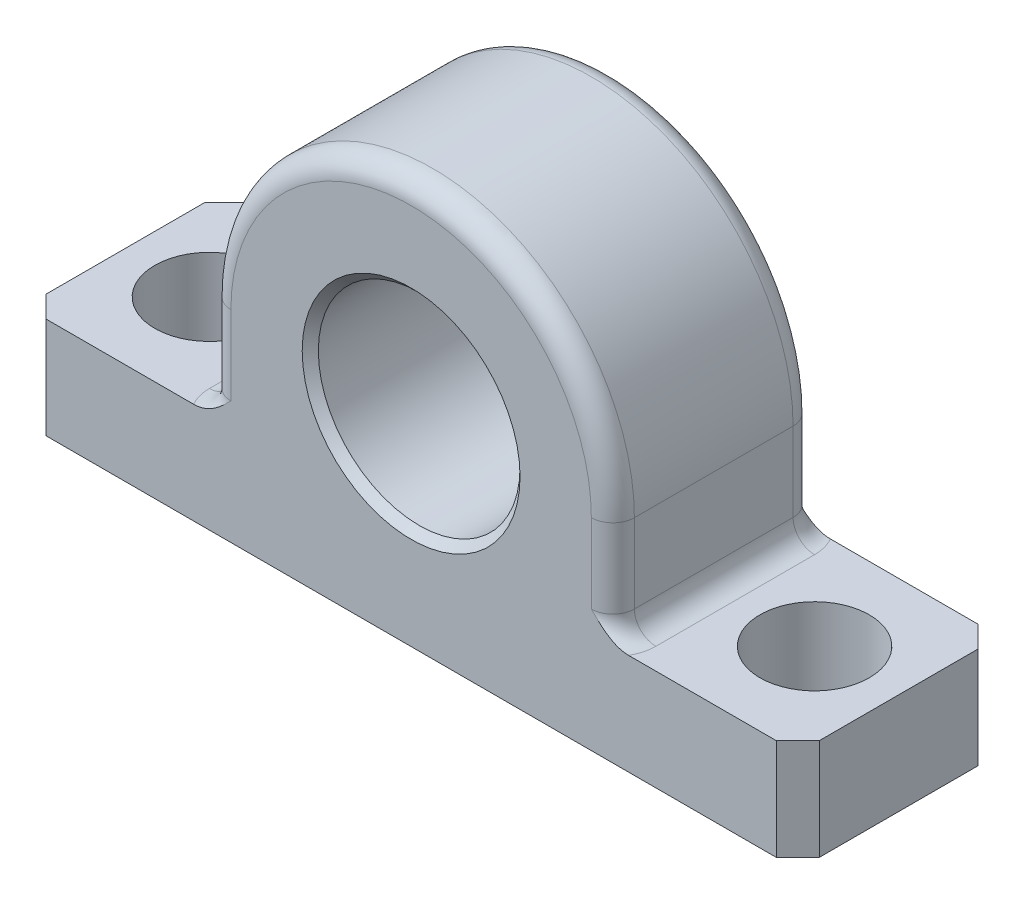
ISO-10303-21;
HEADER;
FILE_DESCRIPTION(('STEP AP214'),'2;1');
FILE_NAME('part.step','',(''),(''),'','','');
FILE_SCHEMA(('AUTOMOTIVE_DESIGN { 1 0 10303 214 1 1 1 1 }'));
ENDSEC;
DATA;
#1=APPLICATION_CONTEXT('core data for automotive mechanical design processes');
#2=APPLICATION_PROTOCOL_DEFINITION('international standard','automotive_design',2000,#1);
#3=PRODUCT_CONTEXT('',#1,'mechanical');
#4=PRODUCT('Part','Part','',(#3));
#5=PRODUCT_RELATED_PRODUCT_CATEGORY('part','',(#4));
#6=PRODUCT_DEFINITION_FORMATION('','',#4);
#7=PRODUCT_DEFINITION_CONTEXT('part definition',#1,'design');
#8=PRODUCT_DEFINITION('design','',#6,#7);
#9=PRODUCT_DEFINITION_SHAPE('','',#8);
#10=(LENGTH_UNIT() NAMED_UNIT(*) SI_UNIT(.MILLI.,.METRE.));
#11=(NAMED_UNIT(*) PLANE_ANGLE_UNIT() SI_UNIT($,.RADIAN.));
#12=(NAMED_UNIT(*) SI_UNIT($,.STERADIAN.) SOLID_ANGLE_UNIT());
#13=UNCERTAINTY_MEASURE_WITH_UNIT(LENGTH_MEASURE(1.E-05),#10,'distance_accuracy_value','');
#14=(GEOMETRIC_REPRESENTATION_CONTEXT(3) GLOBAL_UNCERTAINTY_ASSIGNED_CONTEXT((#13)) GLOBAL_UNIT_ASSIGNED_CONTEXT((#10,
#11,#12)) REPRESENTATION_CONTEXT('',''));
#15=CARTESIAN_POINT('',(0.,0.,0.));
#16=DIRECTION('',(0.,0.,1.));
#17=DIRECTION('',(1.,0.,0.));
#18=AXIS2_PLACEMENT_3D('',#15,#16,#17);
#19=CARTESIAN_POINT('',(0.,9.525,4.7625));
#20=DIRECTION('',(0.,0.,1.));
#21=DIRECTION('',(1.,0.,0.));
#22=AXIS2_PLACEMENT_3D('',#19,#20,#21);
#23=PLANE('',#22);
#24=CARTESIAN_POINT('',(0.,9.525,4.7625));
#25=DIRECTION('',(0.,0.,1.));
#26=DIRECTION('',(1.,0.,0.));
#27=AXIS2_PLACEMENT_3D('',#24,#25,#26);
#28=CIRCLE('',#27,5.14350000000001);
#29=CARTESIAN_POINT('',(5.14350000000001,9.525,4.7625));
#30=VERTEX_POINT('',#29);
#31=EDGE_CURVE('E12',#30,#30,#28,.F.);
#32=ORIENTED_EDGE('',*,*,#31,.T.);
#33=EDGE_LOOP('',(#32));
#34=FACE_BOUND('',#33,.T.);
#35=DIRECTION('',(1.,0.,0.));
#36=VECTOR('',#35,1.);
#37=CARTESIAN_POINT('',(-18.25625,0.,4.7625));
#38=LINE('',#37,#36);
#39=CARTESIAN_POINT('',(-17.24025,0.,4.7625));
#40=VERTEX_POINT('',#39);
#41=CARTESIAN_POINT('',(17.24025,0.,4.7625));
#42=VERTEX_POINT('',#41);
#43=EDGE_CURVE('E560',#40,#42,#38,.T.);
#44=ORIENTED_EDGE('',*,*,#43,.T.);
#45=DIRECTION('',(0.,1.,0.));
#46=VECTOR('',#45,1.);
#47=CARTESIAN_POINT('',(17.24025,4.7752,4.7625));
#48=LINE('',#47,#46);
#49=CARTESIAN_POINT('',(17.24025,4.7752,4.7625));
#50=VERTEX_POINT('',#49);
#51=EDGE_CURVE('E640',#42,#50,#48,.T.);
#52=ORIENTED_EDGE('',*,*,#51,.T.);
#53=DIRECTION('',(-1.,0.,0.));
#54=VECTOR('',#53,1.);
#55=CARTESIAN_POINT('',(18.25625,4.7752,4.7625));
#56=LINE('',#55,#54);
#57=CARTESIAN_POINT('',(10.26876362049,4.7752,4.7625));
#58=VERTEX_POINT('',#57);
#59=EDGE_CURVE('E563',#50,#58,#56,.T.);
#60=ORIENTED_EDGE('',*,*,#59,.T.);
#61=CARTESIAN_POINT('',(10.26876362049,4.7752,4.7625));
#62=CARTESIAN_POINT('',(10.2252224027002,4.77519715153089,4.7625));
#63=CARTESIAN_POINT('',(10.1817186469744,4.77729908415182,4.7625));
#64=CARTESIAN_POINT('',(10.0951431421564,4.78543311730859,4.7625));
#65=CARTESIAN_POINT('',(10.0520708367528,4.79145923686937,4.7625));
#66=CARTESIAN_POINT('',(9.92491100410121,4.8148188166604,4.7625));
#67=CARTESIAN_POINT('',(9.8417731096432,4.83744841735983,4.7625));
#68=CARTESIAN_POINT('',(9.64960395528768,4.90514776145384,4.7625));
#69=CARTESIAN_POINT('',(9.54245182214935,4.9554346756508,4.7625));
#70=CARTESIAN_POINT('',(9.3369479729002,5.0721817196215,4.7625));
#71=CARTESIAN_POINT('',(9.23864879178819,5.13873067438191,4.7625));
#72=CARTESIAN_POINT('',(9.03093152267288,5.29684050941528,4.7625));
#73=CARTESIAN_POINT('',(8.92334332463209,5.39073377638267,4.7625));
#74=CARTESIAN_POINT('',(8.71499236059108,5.585304752486,4.7625));
#75=CARTESIAN_POINT('',(8.61422432576015,5.68597710175247,4.7625));
#76=CARTESIAN_POINT('',(8.51200518031524,5.78819482090242,4.7625));
#77=CARTESIAN_POINT('',(8.5105025899316,5.78969741130469,4.7625));
#78=CARTESIAN_POINT('',(8.509,5.7912,4.7625));
#79=B_SPLINE_CURVE_WITH_KNOTS('',3,(#61,#62,#63,#64,#65,#66,#67,#68,#69,#70,#71,#72,#73,#74,#75,
#76,#77,#78),.UNSPECIFIED.,.F.,.F.,(4,2,2,2,2,2,2,2,4),(0.,0.130511550541221,0.260824648481426,
0.518174407674975,0.871304804754064,1.22640893116385,1.65404399644587,2.08134483510441,
2.08771978608463),.UNSPECIFIED.);
#80=CARTESIAN_POINT('',(8.509,5.7912,4.7625));
#81=VERTEX_POINT('',#80);
#82=EDGE_CURVE('E264',#58,#81,#79,.T.);
#83=ORIENTED_EDGE('',*,*,#82,.T.);
#84=DIRECTION('',(0.,1.,0.));
#85=VECTOR('',#84,1.);
#86=CARTESIAN_POINT('',(8.509,9.525,4.7625));
#87=LINE('',#86,#85);
#88=CARTESIAN_POINT('',(8.509,9.525,4.7625));
#89=VERTEX_POINT('',#88);
#90=EDGE_CURVE('E224',#81,#89,#87,.T.);
#91=ORIENTED_EDGE('',*,*,#90,.T.);
#92=CARTESIAN_POINT('',(0.,9.525,4.7625));
#93=DIRECTION('',(0.,0.,1.));
#94=DIRECTION('',(1.,0.,0.));
#95=AXIS2_PLACEMENT_3D('',#92,#93,#94);
#96=CIRCLE('',#95,8.509);
#97=CARTESIAN_POINT('',(-8.509,9.525,4.7625));
#98=VERTEX_POINT('',#97);
#99=EDGE_CURVE('E222',#89,#98,#96,.T.);
#100=ORIENTED_EDGE('',*,*,#99,.T.);
#101=DIRECTION('',(0.,-1.,0.));
#102=VECTOR('',#101,1.);
#103=CARTESIAN_POINT('',(-8.509,4.7752,4.7625));
#104=LINE('',#103,#102);
#105=CARTESIAN_POINT('',(-8.509,5.7912,4.7625));
#106=VERTEX_POINT('',#105);
#107=EDGE_CURVE('E205',#98,#106,#104,.T.);
#108=ORIENTED_EDGE('',*,*,#107,.T.);
#109=CARTESIAN_POINT('',(-10.26876362049,4.7752,4.7625));
#110=CARTESIAN_POINT('',(-10.2252224027002,4.77519715153089,4.7625));
#111=CARTESIAN_POINT('',(-10.1817186469745,4.77729908415181,4.7625));
#112=CARTESIAN_POINT('',(-10.0951431421564,4.78543311730858,4.7625));
#113=CARTESIAN_POINT('',(-10.0520708367528,4.79145923686936,4.7625));
#114=CARTESIAN_POINT('',(-9.92491100410126,4.81481881666039,4.7625));
#115=CARTESIAN_POINT('',(-9.84177310964322,4.83744841735983,4.7625));
#116=CARTESIAN_POINT('',(-9.64960395528766,4.90514776145384,4.7625));
#117=CARTESIAN_POINT('',(-9.5424518221493,4.9554346756508,4.7625));
#118=CARTESIAN_POINT('',(-9.33694797290018,5.07218171962153,4.7625));
#119=CARTESIAN_POINT('',(-9.23864879178821,5.13873067438196,4.7625));
#120=CARTESIAN_POINT('',(-9.03093152267284,5.29684050941523,4.7625));
#121=CARTESIAN_POINT('',(-8.92334332463192,5.39073377638248,4.7625));
#122=CARTESIAN_POINT('',(-8.71499236059126,5.58530475248616,4.7625));
#123=CARTESIAN_POINT('',(-8.61422432576081,5.68597710175313,4.7625));
#124=CARTESIAN_POINT('',(-8.51200518031525,5.78819482090244,4.7625));
#125=CARTESIAN_POINT('',(-8.5105025899316,5.7896974113047,4.7625));
#126=CARTESIAN_POINT('',(-8.509,5.7912,4.7625));
#127=B_SPLINE_CURVE_WITH_KNOTS('',3,(#109,#110,#111,#112,#113,#114,#115,#116,#117,#118,#119,
#120,#121,#122,#123,#124,#125,#126),.UNSPECIFIED.,.F.,.F.,(4,2,2,2,2,2,2,2,4),(0.,
0.130511550541186,0.260824648481355,0.518174407674975,0.87130480475412,1.22640893116385,
1.65404399644585,2.08134483510441,2.08771978608463),.UNSPECIFIED.);
#128=CARTESIAN_POINT('',(-10.26876362049,4.7752,4.7625));
#129=VERTEX_POINT('',#128);
#130=EDGE_CURVE('E294',#106,#129,#127,.F.);
#131=ORIENTED_EDGE('',*,*,#130,.T.);
#132=DIRECTION('',(-1.,0.,0.));
#133=VECTOR('',#132,1.);
#134=CARTESIAN_POINT('',(-18.25625,4.7752,4.7625));
#135=LINE('',#134,#133);
#136=CARTESIAN_POINT('',(-17.24025,4.7752,4.7625));
#137=VERTEX_POINT('',#136);
#138=EDGE_CURVE('E566',#129,#137,#135,.T.);
#139=ORIENTED_EDGE('',*,*,#138,.T.);
#140=DIRECTION('',(0.,-1.,0.));
#141=VECTOR('',#140,1.);
#142=CARTESIAN_POINT('',(-17.24025,0.,4.7625));
#143=LINE('',#142,#141);
#144=EDGE_CURVE('E637',#137,#40,#143,.T.);
#145=ORIENTED_EDGE('',*,*,#144,.T.);
#146=EDGE_LOOP('',(#44,#52,#60,#83,#91,#100,#108,#131,#139,#145));
#147=FACE_BOUND('',#146,.T.);
#148=ADVANCED_FACE('F36',(#34,#147),#23,.T.);
#149=CARTESIAN_POINT('',(0.,9.525,-4.7625));
#150=DIRECTION('',(0.,0.,1.));
#151=DIRECTION('',(1.,0.,0.));
#152=AXIS2_PLACEMENT_3D('',#149,#150,#151);
#153=PLANE('',#152);
#154=CARTESIAN_POINT('',(0.,9.525,-4.7625));
#155=DIRECTION('',(0.,0.,1.));
#156=DIRECTION('',(1.,0.,0.));
#157=AXIS2_PLACEMENT_3D('',#154,#155,#156);
#158=CIRCLE('',#157,5.14349999999998);
#159=CARTESIAN_POINT('',(5.14349999999999,9.525,-4.7625));
#160=VERTEX_POINT('',#159);
#161=EDGE_CURVE('E351',#160,#160,#158,.T.);
#162=ORIENTED_EDGE('',*,*,#161,.T.);
#163=EDGE_LOOP('',(#162));
#164=FACE_BOUND('',#163,.T.);
#165=DIRECTION('',(-1.,0.,0.));
#166=VECTOR('',#165,1.);
#167=CARTESIAN_POINT('',(18.25625,4.7752,-4.7625));
#168=LINE('',#167,#166);
#169=CARTESIAN_POINT('',(17.24025,4.7752,-4.7625));
#170=VERTEX_POINT('',#169);
#171=CARTESIAN_POINT('',(10.26876362049,4.7752,-4.7625));
#172=VERTEX_POINT('',#171);
#173=EDGE_CURVE('E572',#170,#172,#168,.T.);
#174=ORIENTED_EDGE('',*,*,#173,.F.);
#175=DIRECTION('',(0.,-1.,0.));
#176=VECTOR('',#175,1.);
#177=CARTESIAN_POINT('',(17.24025,9.52500000000002,-4.7625));
#178=LINE('',#177,#176);
#179=CARTESIAN_POINT('',(17.24025,0.,-4.7625));
#180=VERTEX_POINT('',#179);
#181=EDGE_CURVE('E627',#170,#180,#178,.T.);
#182=ORIENTED_EDGE('',*,*,#181,.T.);
#183=DIRECTION('',(1.,0.,0.));
#184=VECTOR('',#183,1.);
#185=CARTESIAN_POINT('',(-18.25625,0.,-4.7625));
#186=LINE('',#185,#184);
#187=CARTESIAN_POINT('',(-17.24025,0.,-4.7625));
#188=VERTEX_POINT('',#187);
#189=EDGE_CURVE('E237',#188,#180,#186,.T.);
#190=ORIENTED_EDGE('',*,*,#189,.F.);
#191=DIRECTION('',(0.,1.,0.));
#192=VECTOR('',#191,1.);
#193=CARTESIAN_POINT('',(-17.24025,9.52500000000002,-4.7625));
#194=LINE('',#193,#192);
#195=CARTESIAN_POINT('',(-17.24025,4.7752,-4.7625));
#196=VERTEX_POINT('',#195);
#197=EDGE_CURVE('E625',#188,#196,#194,.T.);
#198=ORIENTED_EDGE('',*,*,#197,.T.);
#199=DIRECTION('',(-1.,0.,0.));
#200=VECTOR('',#199,1.);
#201=CARTESIAN_POINT('',(-18.25625,4.7752,-4.7625));
#202=LINE('',#201,#200);
#203=CARTESIAN_POINT('',(-10.26876362049,4.7752,-4.7625));
#204=VERTEX_POINT('',#203);
#205=EDGE_CURVE('E564',#204,#196,#202,.T.);
#206=ORIENTED_EDGE('',*,*,#205,.F.);
#207=CARTESIAN_POINT('',(-10.26876362049,4.7752,-4.7625));
#208=CARTESIAN_POINT('',(-10.2252224027002,4.77519715153089,-4.7625));
#209=CARTESIAN_POINT('',(-10.1817186469745,4.77729908415181,-4.7625));
#210=CARTESIAN_POINT('',(-10.0951431421565,4.78543311730858,-4.7625));
#211=CARTESIAN_POINT('',(-10.0520708367528,4.79145923686935,-4.7625));
#212=CARTESIAN_POINT('',(-9.92491100410127,4.81481881666038,-4.7625));
#213=CARTESIAN_POINT('',(-9.84177310964322,4.83744841735982,-4.7625));
#214=CARTESIAN_POINT('',(-9.64960395528765,4.90514776145384,-4.7625));
#215=CARTESIAN_POINT('',(-9.54245182214929,4.95543467565081,-4.7625));
#216=CARTESIAN_POINT('',(-9.33694797290017,5.07218171962154,-4.7625));
#217=CARTESIAN_POINT('',(-9.23864879178822,5.13873067438197,-4.7625));
#218=CARTESIAN_POINT('',(-9.03093152267283,5.29684050941522,-4.7625));
#219=CARTESIAN_POINT('',(-8.92334332463188,5.39073377638242,-4.7625));
#220=CARTESIAN_POINT('',(-8.71499236059133,5.58530475248621,-4.7625));
#221=CARTESIAN_POINT('',(-8.61422432576102,5.68597710175332,-4.7625));
#222=CARTESIAN_POINT('',(-8.51200518031526,5.78819482090244,-4.7625));
#223=CARTESIAN_POINT('',(-8.51050258993161,5.7896974113047,-4.7625));
#224=CARTESIAN_POINT('',(-8.509,5.7912,-4.7625));
#225=B_SPLINE_CURVE_WITH_KNOTS('',3,(#207,#208,#209,#210,#211,#212,#213,#214,#215,#216,#217,
#218,#219,#220,#221,#222,#223,#224),.UNSPECIFIED.,.F.,.F.,(4,2,2,2,2,2,2,2,4),(0.,
0.130511550541176,0.260824648481334,0.518174407674975,0.871304804754135,1.22640893116385,
1.65404399644583,2.0813448351044,2.08771978608463),.UNSPECIFIED.);
#226=CARTESIAN_POINT('',(-8.509,5.7912,-4.7625));
#227=VERTEX_POINT('',#226);
#228=EDGE_CURVE('E301',#204,#227,#225,.T.);
#229=ORIENTED_EDGE('',*,*,#228,.T.);
#230=DIRECTION('',(0.,-1.,0.));
#231=VECTOR('',#230,1.);
#232=CARTESIAN_POINT('',(-8.509,9.525,-4.7625));
#233=LINE('',#232,#231);
#234=CARTESIAN_POINT('',(-8.509,9.525,-4.7625));
#235=VERTEX_POINT('',#234);
#236=EDGE_CURVE('E214',#227,#235,#233,.F.);
#237=ORIENTED_EDGE('',*,*,#236,.T.);
#238=CARTESIAN_POINT('',(0.,9.525,-4.7625));
#239=DIRECTION('',(0.,0.,1.));
#240=DIRECTION('',(1.,0.,0.));
#241=AXIS2_PLACEMENT_3D('',#238,#239,#240);
#242=CIRCLE('',#241,8.509);
#243=CARTESIAN_POINT('',(8.509,9.525,-4.7625));
#244=VERTEX_POINT('',#243);
#245=EDGE_CURVE('E217',#235,#244,#242,.F.);
#246=ORIENTED_EDGE('',*,*,#245,.T.);
#247=DIRECTION('',(0.,1.,0.));
#248=VECTOR('',#247,1.);
#249=CARTESIAN_POINT('',(8.509,9.525,-4.7625));
#250=LINE('',#249,#248);
#251=CARTESIAN_POINT('',(8.509,5.7912,-4.7625));
#252=VERTEX_POINT('',#251);
#253=EDGE_CURVE('E585',#244,#252,#250,.F.);
#254=ORIENTED_EDGE('',*,*,#253,.T.);
#255=CARTESIAN_POINT('',(10.26876362049,4.7752,-4.7625));
#256=CARTESIAN_POINT('',(10.2252224027002,4.77519715153089,-4.7625));
#257=CARTESIAN_POINT('',(10.1817186469745,4.77729908415182,-4.7625));
#258=CARTESIAN_POINT('',(10.0951431421565,4.78543311730858,-4.7625));
#259=CARTESIAN_POINT('',(10.0520708367529,4.79145923686935,-4.7625));
#260=CARTESIAN_POINT('',(9.92491100410128,4.81481881666038,-4.7625));
#261=CARTESIAN_POINT('',(9.84177310964323,4.83744841735982,-4.7625));
#262=CARTESIAN_POINT('',(9.64960395528765,4.90514776145384,-4.7625));
#263=CARTESIAN_POINT('',(9.54245182214928,4.95543467565081,-4.7625));
#264=CARTESIAN_POINT('',(9.33694797290017,5.07218171962155,-4.7625));
#265=CARTESIAN_POINT('',(9.23864879178823,5.13873067438198,-4.7625));
#266=CARTESIAN_POINT('',(9.03093152267283,5.29684050941521,-4.7625));
#267=CARTESIAN_POINT('',(8.92334332463185,5.39073377638239,-4.7625));
#268=CARTESIAN_POINT('',(8.71499236059137,5.58530475248624,-4.7625));
#269=CARTESIAN_POINT('',(8.61422432576116,5.68597710175345,-4.7625));
#270=CARTESIAN_POINT('',(8.51200518031527,5.78819482090245,-4.7625));
#271=CARTESIAN_POINT('',(8.51050258993161,5.78969741130471,-4.7625));
#272=CARTESIAN_POINT('',(8.509,5.7912,-4.7625));
#273=B_SPLINE_CURVE_WITH_KNOTS('',3,(#255,#256,#257,#258,#259,#260,#261,#262,#263,#264,#265,
#266,#267,#268,#269,#270,#271,#272),.UNSPECIFIED.,.F.,.F.,(4,2,2,2,2,2,2,2,4),(0.,
0.130511550541169,0.26082464848132,0.518174407674974,0.871304804754147,1.22640893116385,
1.65404399644582,2.0813448351044,2.08771978608463),.UNSPECIFIED.);
#274=EDGE_CURVE('E272',#252,#172,#273,.F.);
#275=ORIENTED_EDGE('',*,*,#274,.T.);
#276=EDGE_LOOP('',(#174,#182,#190,#198,#206,#229,#237,#246,#254,#275));
#277=FACE_BOUND('',#276,.T.);
#278=ADVANCED_FACE('F287',(#164,#277),#153,.F.);
#279=CARTESIAN_POINT('',(-18.25625,0.,4.7625));
#280=DIRECTION('',(0.,1.,0.));
#281=DIRECTION('',(-1.,0.,0.));
#282=AXIS2_PLACEMENT_3D('',#279,#280,#281);
#283=PLANE('',#282);
#284=CARTESIAN_POINT('',(-14.2875,0.,0.));
#285=DIRECTION('',(0.,1.,0.));
#286=DIRECTION('',(-1.,0.,0.));
#287=AXIS2_PLACEMENT_3D('',#284,#285,#286);
#288=CIRCLE('',#287,2.5796875);
#289=CARTESIAN_POINT('',(-16.8671875,0.,0.));
#290=VERTEX_POINT('',#289);
#291=EDGE_CURVE('E610',#290,#290,#288,.T.);
#292=ORIENTED_EDGE('',*,*,#291,.T.);
#293=EDGE_LOOP('',(#292));
#294=FACE_BOUND('',#293,.T.);
#295=CARTESIAN_POINT('',(14.2875,0.,0.));
#296=DIRECTION('',(0.,1.,0.));
#297=DIRECTION('',(1.,0.,0.));
#298=AXIS2_PLACEMENT_3D('',#295,#296,#297);
#299=CIRCLE('',#298,2.57968749999999);
#300=CARTESIAN_POINT('',(16.8671875,0.,0.));
#301=VERTEX_POINT('',#300);
#302=EDGE_CURVE('E551',#301,#301,#299,.T.);
#303=ORIENTED_EDGE('',*,*,#302,.T.);
#304=EDGE_LOOP('',(#303));
#305=FACE_BOUND('',#304,.T.);
#306=ORIENTED_EDGE('',*,*,#189,.T.);
#307=DIRECTION('',(-0.707106781186548,0.,-0.707106781186548));
#308=VECTOR('',#307,1.);
#309=CARTESIAN_POINT('',(18.25625,0.,-3.7465));
#310=LINE('',#309,#308);
#311=CARTESIAN_POINT('',(18.25625,0.,-3.7465));
#312=VERTEX_POINT('',#311);
#313=EDGE_CURVE('E635',#180,#312,#310,.F.);
#314=ORIENTED_EDGE('',*,*,#313,.T.);
#315=DIRECTION('',(0.,0.,-1.));
#316=VECTOR('',#315,1.);
#317=CARTESIAN_POINT('',(18.25625,0.,4.7625));
#318=LINE('',#317,#316);
#319=CARTESIAN_POINT('',(18.25625,0.,3.7465));
#320=VERTEX_POINT('',#319);
#321=EDGE_CURVE('E187',#320,#312,#318,.T.);
#322=ORIENTED_EDGE('',*,*,#321,.F.);
#323=DIRECTION('',(-0.707106781186548,0.,0.707106781186548));
#324=VECTOR('',#323,1.);
#325=CARTESIAN_POINT('',(17.24025,0.,4.76250000000001));
#326=LINE('',#325,#324);
#327=EDGE_CURVE('E633',#320,#42,#326,.T.);
#328=ORIENTED_EDGE('',*,*,#327,.T.);
#329=ORIENTED_EDGE('',*,*,#43,.F.);
#330=DIRECTION('',(-0.707106781186547,0.,-0.707106781186547));
#331=VECTOR('',#330,1.);
#332=CARTESIAN_POINT('',(-17.24025,0.,4.76250000000001));
#333=LINE('',#332,#331);
#334=CARTESIAN_POINT('',(-18.25625,0.,3.74649999999999));
#335=VERTEX_POINT('',#334);
#336=EDGE_CURVE('E629',#40,#335,#333,.T.);
#337=ORIENTED_EDGE('',*,*,#336,.T.);
#338=DIRECTION('',(0.,0.,-1.));
#339=VECTOR('',#338,1.);
#340=CARTESIAN_POINT('',(-18.25625,0.,4.7625));
#341=LINE('',#340,#339);
#342=CARTESIAN_POINT('',(-18.25625,0.,-3.7465));
#343=VERTEX_POINT('',#342);
#344=EDGE_CURVE('E569',#335,#343,#341,.T.);
#345=ORIENTED_EDGE('',*,*,#344,.T.);
#346=DIRECTION('',(-0.707106781186548,0.,0.707106781186548));
#347=VECTOR('',#346,1.);
#348=CARTESIAN_POINT('',(-18.25625,0.,-3.7465));
#349=LINE('',#348,#347);
#350=EDGE_CURVE('E631',#343,#188,#349,.F.);
#351=ORIENTED_EDGE('',*,*,#350,.T.);
#352=EDGE_LOOP('',(#306,#314,#322,#328,#329,#337,#345,#351));
#353=FACE_BOUND('',#352,.T.);
#354=ADVANCED_FACE('F396',(#294,#305,#353),#283,.F.);
#355=CARTESIAN_POINT('',(18.25625,0.,4.7625));
#356=DIRECTION('',(-1.,0.,0.));
#357=DIRECTION('',(0.,-1.,0.));
#358=AXIS2_PLACEMENT_3D('',#355,#356,#357);
#359=PLANE('',#358);
#360=ORIENTED_EDGE('',*,*,#321,.T.);
#361=DIRECTION('',(0.,1.,0.));
#362=VECTOR('',#361,1.);
#363=CARTESIAN_POINT('',(18.25625,0.,-3.7465));
#364=LINE('',#363,#362);
#365=CARTESIAN_POINT('',(18.25625,4.7752,-3.7465));
#366=VERTEX_POINT('',#365);
#367=EDGE_CURVE('E618',#312,#366,#364,.T.);
#368=ORIENTED_EDGE('',*,*,#367,.T.);
#369=DIRECTION('',(0.,0.,-1.));
#370=VECTOR('',#369,1.);
#371=CARTESIAN_POINT('',(18.25625,4.7752,4.7625));
#372=LINE('',#371,#370);
#373=CARTESIAN_POINT('',(18.25625,4.7752,3.7465));
#374=VERTEX_POINT('',#373);
#375=EDGE_CURVE('E579',#374,#366,#372,.T.);
#376=ORIENTED_EDGE('',*,*,#375,.F.);
#377=DIRECTION('',(0.,-1.,0.));
#378=VECTOR('',#377,1.);
#379=CARTESIAN_POINT('',(18.25625,0.,3.7465));
#380=LINE('',#379,#378);
#381=EDGE_CURVE('E616',#374,#320,#380,.T.);
#382=ORIENTED_EDGE('',*,*,#381,.T.);
#383=EDGE_LOOP('',(#360,#368,#376,#382));
#384=FACE_BOUND('',#383,.T.);
#385=ADVANCED_FACE('F392',(#384),#359,.F.);
#386=CARTESIAN_POINT('',(18.25625,4.7752,4.7625));
#387=DIRECTION('',(0.,-1.,0.));
#388=DIRECTION('',(1.,0.,0.));
#389=AXIS2_PLACEMENT_3D('',#386,#387,#388);
#390=PLANE('',#389);
#391=CARTESIAN_POINT('',(14.2875,4.7752,0.));
#392=DIRECTION('',(0.,1.,0.));
#393=DIRECTION('',(1.,0.,0.));
#394=AXIS2_PLACEMENT_3D('',#391,#392,#393);
#395=CIRCLE('',#394,2.57968749999999);
#396=CARTESIAN_POINT('',(16.8671875,4.7752,0.));
#397=VERTEX_POINT('',#396);
#398=EDGE_CURVE('E554',#397,#397,#395,.T.);
#399=ORIENTED_EDGE('',*,*,#398,.F.);
#400=EDGE_LOOP('',(#399));
#401=FACE_BOUND('',#400,.T.);
#402=ORIENTED_EDGE('',*,*,#375,.T.);
#403=DIRECTION('',(0.707106781186548,0.,0.707106781186548));
#404=VECTOR('',#403,1.);
#405=CARTESIAN_POINT('',(18.25625,4.7752,-3.7465));
#406=LINE('',#405,#404);
#407=EDGE_CURVE('E623',#366,#170,#406,.F.);
#408=ORIENTED_EDGE('',*,*,#407,.T.);
#409=ORIENTED_EDGE('',*,*,#173,.T.);
#410=CARTESIAN_POINT('',(8.509,4.7752,-3.7465));
#411=DIRECTION('',(0.,-1.,0.));
#412=DIRECTION('',(1.,0.,0.));
#413=AXIS2_PLACEMENT_3D('',#410,#411,#412);
#414=CIRCLE('',#413,2.032);
#415=CARTESIAN_POINT('',(10.541,4.7752,-3.7465));
#416=VERTEX_POINT('',#415);
#417=EDGE_CURVE('E241',#172,#416,#414,.T.);
#418=ORIENTED_EDGE('',*,*,#417,.T.);
#419=DIRECTION('',(0.,0.,-1.));
#420=VECTOR('',#419,1.);
#421=CARTESIAN_POINT('',(10.541,4.7752,3.7465));
#422=LINE('',#421,#420);
#423=CARTESIAN_POINT('',(10.541,4.7752,3.7465));
#424=VERTEX_POINT('',#423);
#425=EDGE_CURVE('E231',#416,#424,#422,.F.);
#426=ORIENTED_EDGE('',*,*,#425,.T.);
#427=CARTESIAN_POINT('',(8.509,4.7752,3.7465));
#428=DIRECTION('',(0.,-1.,0.));
#429=DIRECTION('',(1.,0.,0.));
#430=AXIS2_PLACEMENT_3D('',#427,#428,#429);
#431=CIRCLE('',#430,2.032);
#432=EDGE_CURVE('E243',#424,#58,#431,.T.);
#433=ORIENTED_EDGE('',*,*,#432,.T.);
#434=ORIENTED_EDGE('',*,*,#59,.F.);
#435=DIRECTION('',(0.707106781186548,0.,-0.707106781186548));
#436=VECTOR('',#435,1.);
#437=CARTESIAN_POINT('',(17.24025,4.7752,4.7625));
#438=LINE('',#437,#436);
#439=EDGE_CURVE('E621',#50,#374,#438,.T.);
#440=ORIENTED_EDGE('',*,*,#439,.T.);
#441=EDGE_LOOP('',(#402,#408,#409,#418,#426,#433,#434,#440));
#442=FACE_BOUND('',#441,.T.);
#443=ADVANCED_FACE('F388',(#401,#442),#390,.F.);
#444=CARTESIAN_POINT('',(9.525,4.7752,4.7625));
#445=DIRECTION('',(-1.,0.,0.));
#446=DIRECTION('',(0.,0.,1.));
#447=AXIS2_PLACEMENT_3D('',#444,#445,#446);
#448=PLANE('',#447);
#449=DIRECTION('',(0.,1.,0.));
#450=VECTOR('',#449,1.);
#451=CARTESIAN_POINT('',(9.525,4.7752,3.7465));
#452=LINE('',#451,#450);
#453=CARTESIAN_POINT('',(9.525,9.525,3.7465));
#454=VERTEX_POINT('',#453);
#455=CARTESIAN_POINT('',(9.525,5.7912,3.7465));
#456=VERTEX_POINT('',#455);
#457=EDGE_CURVE('E228',#454,#456,#452,.F.);
#458=ORIENTED_EDGE('',*,*,#457,.T.);
#459=DIRECTION('',(0.,0.,-1.));
#460=VECTOR('',#459,1.);
#461=CARTESIAN_POINT('',(9.525,5.7912,-3.7465));
#462=LINE('',#461,#460);
#463=CARTESIAN_POINT('',(9.525,5.7912,-3.7465));
#464=VERTEX_POINT('',#463);
#465=EDGE_CURVE('E261',#456,#464,#462,.T.);
#466=ORIENTED_EDGE('',*,*,#465,.T.);
#467=DIRECTION('',(0.,1.,0.));
#468=VECTOR('',#467,1.);
#469=CARTESIAN_POINT('',(9.525,4.7752,-3.7465));
#470=LINE('',#469,#468);
#471=CARTESIAN_POINT('',(9.525,9.525,-3.7465));
#472=VERTEX_POINT('',#471);
#473=EDGE_CURVE('E226',#464,#472,#470,.T.);
#474=ORIENTED_EDGE('',*,*,#473,.T.);
#475=DIRECTION('',(0.,0.,-1.));
#476=VECTOR('',#475,1.);
#477=CARTESIAN_POINT('',(9.525,9.525,4.7625));
#478=LINE('',#477,#476);
#479=EDGE_CURVE('E197',#454,#472,#478,.T.);
#480=ORIENTED_EDGE('',*,*,#479,.F.);
#481=EDGE_LOOP('',(#458,#466,#474,#480));
#482=FACE_BOUND('',#481,.T.);
#483=ADVANCED_FACE('F385',(#482),#448,.F.);
#484=CARTESIAN_POINT('',(0.,9.525,4.7625));
#485=DIRECTION('',(0.,0.,-1.));
#486=DIRECTION('',(-1.,0.,0.));
#487=AXIS2_PLACEMENT_3D('',#484,#485,#486);
#488=CYLINDRICAL_SURFACE('',#487,9.525);
#489=ORIENTED_EDGE('',*,*,#479,.T.);
#490=CARTESIAN_POINT('',(0.,9.525,-3.7465));
#491=DIRECTION('',(0.,0.,1.));
#492=DIRECTION('',(1.,0.,0.));
#493=AXIS2_PLACEMENT_3D('',#490,#491,#492);
#494=CIRCLE('',#493,9.525);
#495=CARTESIAN_POINT('',(-9.525,9.525,-3.7465));
#496=VERTEX_POINT('',#495);
#497=EDGE_CURVE('E196',#472,#496,#494,.T.);
#498=ORIENTED_EDGE('',*,*,#497,.T.);
#499=DIRECTION('',(0.,0.,-1.));
#500=VECTOR('',#499,1.);
#501=CARTESIAN_POINT('',(-9.525,9.525,4.7625));
#502=LINE('',#501,#500);
#503=CARTESIAN_POINT('',(-9.525,9.525,3.7465));
#504=VERTEX_POINT('',#503);
#505=EDGE_CURVE('E179',#504,#496,#502,.T.);
#506=ORIENTED_EDGE('',*,*,#505,.F.);
#507=CARTESIAN_POINT('',(0.,9.525,3.7465));
#508=DIRECTION('',(0.,0.,1.));
#509=DIRECTION('',(1.,0.,0.));
#510=AXIS2_PLACEMENT_3D('',#507,#508,#509);
#511=CIRCLE('',#510,9.525);
#512=EDGE_CURVE('E193',#504,#454,#511,.F.);
#513=ORIENTED_EDGE('',*,*,#512,.T.);
#514=EDGE_LOOP('',(#489,#498,#506,#513));
#515=FACE_BOUND('',#514,.T.);
#516=ADVANCED_FACE('F191',(#515),#488,.T.);
#517=CARTESIAN_POINT('',(-9.525,4.7752,4.7625));
#518=DIRECTION('',(1.,0.,0.));
#519=DIRECTION('',(0.,0.,-1.));
#520=AXIS2_PLACEMENT_3D('',#517,#518,#519);
#521=PLANE('',#520);
#522=DIRECTION('',(0.,-1.,0.));
#523=VECTOR('',#522,1.);
#524=CARTESIAN_POINT('',(-9.525,4.7752,-3.7465));
#525=LINE('',#524,#523);
#526=CARTESIAN_POINT('',(-9.525,5.7912,-3.7465));
#527=VERTEX_POINT('',#526);
#528=EDGE_CURVE('E186',#496,#527,#525,.T.);
#529=ORIENTED_EDGE('',*,*,#528,.T.);
#530=DIRECTION('',(0.,0.,-1.));
#531=VECTOR('',#530,1.);
#532=CARTESIAN_POINT('',(-9.525,5.7912,3.7465));
#533=LINE('',#532,#531);
#534=CARTESIAN_POINT('',(-9.525,5.7912,3.7465));
#535=VERTEX_POINT('',#534);
#536=EDGE_CURVE('E182',#527,#535,#533,.F.);
#537=ORIENTED_EDGE('',*,*,#536,.T.);
#538=DIRECTION('',(0.,-1.,0.));
#539=VECTOR('',#538,1.);
#540=CARTESIAN_POINT('',(-9.525,9.525,3.7465));
#541=LINE('',#540,#539);
#542=EDGE_CURVE('E175',#535,#504,#541,.F.);
#543=ORIENTED_EDGE('',*,*,#542,.T.);
#544=ORIENTED_EDGE('',*,*,#505,.T.);
#545=EDGE_LOOP('',(#529,#537,#543,#544));
#546=FACE_BOUND('',#545,.T.);
#547=ADVANCED_FACE('F178',(#546),#521,.F.);
#548=CARTESIAN_POINT('',(-18.25625,4.7752,4.7625));
#549=DIRECTION('',(0.,-1.,0.));
#550=DIRECTION('',(1.,0.,0.));
#551=AXIS2_PLACEMENT_3D('',#548,#549,#550);
#552=PLANE('',#551);
#553=CARTESIAN_POINT('',(-14.2875,4.77519999999999,0.));
#554=DIRECTION('',(0.,1.,0.));
#555=DIRECTION('',(-1.,0.,0.));
#556=AXIS2_PLACEMENT_3D('',#553,#554,#555);
#557=CIRCLE('',#556,2.5796875);
#558=CARTESIAN_POINT('',(-16.8671875,4.77519999999999,0.));
#559=VERTEX_POINT('',#558);
#560=EDGE_CURVE('E556',#559,#559,#557,.T.);
#561=ORIENTED_EDGE('',*,*,#560,.F.);
#562=EDGE_LOOP('',(#561));
#563=FACE_BOUND('',#562,.T.);
#564=ORIENTED_EDGE('',*,*,#205,.T.);
#565=DIRECTION('',(0.707106781186548,0.,-0.707106781186548));
#566=VECTOR('',#565,1.);
#567=CARTESIAN_POINT('',(-18.25625,4.7752,-3.7465));
#568=LINE('',#567,#566);
#569=CARTESIAN_POINT('',(-18.25625,4.7752,-3.7465));
#570=VERTEX_POINT('',#569);
#571=EDGE_CURVE('E51',#196,#570,#568,.F.);
#572=ORIENTED_EDGE('',*,*,#571,.T.);
#573=DIRECTION('',(0.,0.,-1.));
#574=VECTOR('',#573,1.);
#575=CARTESIAN_POINT('',(-18.25625,4.7752,4.7625));
#576=LINE('',#575,#574);
#577=CARTESIAN_POINT('',(-18.25625,4.7752,3.74649999999999));
#578=VERTEX_POINT('',#577);
#579=EDGE_CURVE('E198',#578,#570,#576,.T.);
#580=ORIENTED_EDGE('',*,*,#579,.F.);
#581=DIRECTION('',(0.707106781186547,0.,0.707106781186547));
#582=VECTOR('',#581,1.);
#583=CARTESIAN_POINT('',(-17.24025,4.7752,4.7625));
#584=LINE('',#583,#582);
#585=EDGE_CURVE('E357',#578,#137,#584,.T.);
#586=ORIENTED_EDGE('',*,*,#585,.T.);
#587=ORIENTED_EDGE('',*,*,#138,.F.);
#588=CARTESIAN_POINT('',(-8.509,4.7752,3.7465));
#589=DIRECTION('',(0.,-1.,0.));
#590=DIRECTION('',(1.,0.,0.));
#591=AXIS2_PLACEMENT_3D('',#588,#589,#590);
#592=CIRCLE('',#591,2.032);
#593=CARTESIAN_POINT('',(-10.541,4.7752,3.7465));
#594=VERTEX_POINT('',#593);
#595=EDGE_CURVE('E254',#129,#594,#592,.T.);
#596=ORIENTED_EDGE('',*,*,#595,.T.);
#597=DIRECTION('',(0.,0.,-1.));
#598=VECTOR('',#597,1.);
#599=CARTESIAN_POINT('',(-10.541,4.7752,-3.7465));
#600=LINE('',#599,#598);
#601=CARTESIAN_POINT('',(-10.541,4.7752,-3.7465));
#602=VERTEX_POINT('',#601);
#603=EDGE_CURVE('E250',#594,#602,#600,.T.);
#604=ORIENTED_EDGE('',*,*,#603,.T.);
#605=CARTESIAN_POINT('',(-8.509,4.7752,-3.7465));
#606=DIRECTION('',(0.,-1.,0.));
#607=DIRECTION('',(1.,0.,0.));
#608=AXIS2_PLACEMENT_3D('',#605,#606,#607);
#609=CIRCLE('',#608,2.032);
#610=EDGE_CURVE('E252',#602,#204,#609,.T.);
#611=ORIENTED_EDGE('',*,*,#610,.T.);
#612=EDGE_LOOP('',(#564,#572,#580,#586,#587,#596,#604,#611));
#613=FACE_BOUND('',#612,.T.);
#614=ADVANCED_FACE('F374',(#563,#613),#552,.F.);
#615=CARTESIAN_POINT('',(-18.25625,0.,4.7625));
#616=DIRECTION('',(1.,0.,0.));
#617=DIRECTION('',(0.,1.,0.));
#618=AXIS2_PLACEMENT_3D('',#615,#616,#617);
#619=PLANE('',#618);
#620=ORIENTED_EDGE('',*,*,#579,.T.);
#621=DIRECTION('',(0.,-1.,0.));
#622=VECTOR('',#621,1.);
#623=CARTESIAN_POINT('',(-18.25625,0.,-3.7465));
#624=LINE('',#623,#622);
#625=EDGE_CURVE('E644',#570,#343,#624,.T.);
#626=ORIENTED_EDGE('',*,*,#625,.T.);
#627=ORIENTED_EDGE('',*,*,#344,.F.);
#628=DIRECTION('',(0.,1.,0.));
#629=VECTOR('',#628,1.);
#630=CARTESIAN_POINT('',(-18.25625,4.7752,3.74649999999999));
#631=LINE('',#630,#629);
#632=EDGE_CURVE('E58',#335,#578,#631,.T.);
#633=ORIENTED_EDGE('',*,*,#632,.T.);
#634=EDGE_LOOP('',(#620,#626,#627,#633));
#635=FACE_BOUND('',#634,.T.);
#636=ADVANCED_FACE('F364',(#635),#619,.F.);
#637=CARTESIAN_POINT('',(0.,9.525,4.7625));
#638=DIRECTION('',(0.,0.,-1.));
#639=DIRECTION('',(-1.,0.,0.));
#640=AXIS2_PLACEMENT_3D('',#637,#638,#639);
#641=CYLINDRICAL_SURFACE('',#640,4.7625);
#642=CARTESIAN_POINT('',(0.,9.525,-4.38150000000002));
#643=DIRECTION('',(0.,0.,1.));
#644=DIRECTION('',(1.,0.,0.));
#645=AXIS2_PLACEMENT_3D('',#642,#643,#644);
#646=CIRCLE('',#645,4.7625);
#647=CARTESIAN_POINT('',(-4.7625,9.525,-4.38150000000002));
#648=VERTEX_POINT('',#647);
#649=EDGE_CURVE('E44',#648,#648,#646,.F.);
#650=CARTESIAN_POINT('',(0.,9.525,4.3815));
#651=DIRECTION('',(0.,0.,1.));
#652=DIRECTION('',(1.,0.,0.));
#653=AXIS2_PLACEMENT_3D('',#650,#651,#652);
#654=CIRCLE('',#653,4.7625);
#655=CARTESIAN_POINT('',(-4.7625,9.525,4.3815));
#656=VERTEX_POINT('',#655);
#657=EDGE_CURVE('E353',#656,#656,#654,.T.);
#658=CARTESIAN_POINT('',(-4.7625,9.525,-4.38150000000002));
#659=CARTESIAN_POINT('',(-4.7625,9.525,-4.29021875000002));
#660=CARTESIAN_POINT('',(-4.7625,9.525,-4.19893750000002));
#661=CARTESIAN_POINT('',(-4.7625,9.525,-4.01637500000002));
#662=CARTESIAN_POINT('',(-4.7625,9.525,-3.92509375000002));
#663=CARTESIAN_POINT('',(-4.7625,9.525,-3.74253125000002));
#664=CARTESIAN_POINT('',(-4.7625,9.525,-3.65125000000002));
#665=CARTESIAN_POINT('',(-4.7625,9.525,-3.46868750000002));
#666=CARTESIAN_POINT('',(-4.7625,9.525,-3.37740625000002));
#667=CARTESIAN_POINT('',(-4.7625,9.525,-3.19484375000002));
#668=CARTESIAN_POINT('',(-4.7625,9.525,-3.10356250000002));
#669=CARTESIAN_POINT('',(-4.7625,9.525,-2.92100000000002));
#670=CARTESIAN_POINT('',(-4.7625,9.525,-2.82971875000002));
#671=CARTESIAN_POINT('',(-4.7625,9.525,-2.64715625000002));
#672=CARTESIAN_POINT('',(-4.7625,9.525,-2.55587500000002));
#673=CARTESIAN_POINT('',(-4.7625,9.525,-2.37331250000002));
#674=CARTESIAN_POINT('',(-4.7625,9.525,-2.28203125000002));
#675=CARTESIAN_POINT('',(-4.7625,9.525,-2.09946875000002));
#676=CARTESIAN_POINT('',(-4.7625,9.525,-2.00818750000002));
#677=CARTESIAN_POINT('',(-4.7625,9.525,-1.82562500000001));
#678=CARTESIAN_POINT('',(-4.7625,9.525,-1.73434375000001));
#679=CARTESIAN_POINT('',(-4.7625,9.525,-1.55178125000001));
#680=CARTESIAN_POINT('',(-4.7625,9.525,-1.46050000000001));
#681=CARTESIAN_POINT('',(-4.7625,9.525,-1.27793750000001));
#682=CARTESIAN_POINT('',(-4.7625,9.525,-1.18665625000001));
#683=CARTESIAN_POINT('',(-4.7625,9.525,-1.00409375000001));
#684=CARTESIAN_POINT('',(-4.7625,9.525,-0.912812500000013));
#685=CARTESIAN_POINT('',(-4.7625,9.525,-0.730250000000012));
#686=CARTESIAN_POINT('',(-4.7625,9.525,-0.638968750000012));
#687=CARTESIAN_POINT('',(-4.7625,9.525,-0.456406250000012));
#688=CARTESIAN_POINT('',(-4.7625,9.525,-0.365125000000012));
#689=CARTESIAN_POINT('',(-4.7625,9.525,-0.182562500000012));
#690=CARTESIAN_POINT('',(-4.7625,9.525,-0.0912812500000115));
#691=CARTESIAN_POINT('',(-4.7625,9.525,0.0912812499999889));
#692=CARTESIAN_POINT('',(-4.7625,9.525,0.182562499999989));
#693=CARTESIAN_POINT('',(-4.7625,9.525,0.36512499999999));
#694=CARTESIAN_POINT('',(-4.7625,9.525,0.45640624999999));
#695=CARTESIAN_POINT('',(-4.7625,9.525,0.63896874999999));
#696=CARTESIAN_POINT('',(-4.7625,9.525,0.73024999999999));
#697=CARTESIAN_POINT('',(-4.7625,9.525,0.91281249999999));
#698=CARTESIAN_POINT('',(-4.7625,9.525,1.00409374999999));
#699=CARTESIAN_POINT('',(-4.7625,9.525,1.18665624999999));
#700=CARTESIAN_POINT('',(-4.7625,9.525,1.27793749999999));
#701=CARTESIAN_POINT('',(-4.7625,9.525,1.46049999999999));
#702=CARTESIAN_POINT('',(-4.7625,9.525,1.55178124999999));
#703=CARTESIAN_POINT('',(-4.7625,9.525,1.73434374999999));
#704=CARTESIAN_POINT('',(-4.7625,9.525,1.82562499999999));
#705=CARTESIAN_POINT('',(-4.7625,9.525,2.00818749999999));
#706=CARTESIAN_POINT('',(-4.7625,9.525,2.09946874999999));
#707=CARTESIAN_POINT('',(-4.7625,9.525,2.28203124999999));
#708=CARTESIAN_POINT('',(-4.7625,9.525,2.37331249999999));
#709=CARTESIAN_POINT('',(-4.7625,9.525,2.55587499999999));
#710=CARTESIAN_POINT('',(-4.7625,9.525,2.64715624999999));
#711=CARTESIAN_POINT('',(-4.7625,9.525,2.82971874999999));
#712=CARTESIAN_POINT('',(-4.7625,9.525,2.92099999999999));
#713=CARTESIAN_POINT('',(-4.7625,9.525,3.10356249999999));
#714=CARTESIAN_POINT('',(-4.7625,9.525,3.19484374999999));
#715=CARTESIAN_POINT('',(-4.7625,9.525,3.37740624999999));
#716=CARTESIAN_POINT('',(-4.7625,9.525,3.46868749999999));
#717=CARTESIAN_POINT('',(-4.7625,9.525,3.65124999999999));
#718=CARTESIAN_POINT('',(-4.7625,9.525,3.74253124999999));
#719=CARTESIAN_POINT('',(-4.7625,9.525,3.92509374999999));
#720=CARTESIAN_POINT('',(-4.7625,9.525,4.01637499999999));
#721=CARTESIAN_POINT('',(-4.7625,9.525,4.1989375));
#722=CARTESIAN_POINT('',(-4.7625,9.525,4.29021875));
#723=CARTESIAN_POINT('',(-4.7625,9.525,4.3815));
#724=B_SPLINE_CURVE_WITH_KNOTS('',3,(#658,#659,#660,#661,#662,#663,#664,#665,#666,#667,#668,
#669,#670,#671,#672,#673,#674,#675,#676,#677,#678,#679,#680,#681,#682,#683,#684,#685,#686,#687,
#688,#689,#690,#691,#692,#693,#694,#695,#696,#697,#698,#699,#700,#701,#702,#703,#704,#705,#706,
#707,#708,#709,#710,#711,#712,#713,#714,#715,#716,#717,#718,#719,#720,#721,#722,#723),
.UNSPECIFIED.,.F.,.F.,(4,2,2,2,2,2,2,2,2,2,2,2,2,2,2,2,2,2,2,2,2,2,2,2,2,2,2,2,2,2,2,2,4),(0.,
0.273843750000001,0.547687500000001,0.821531250000002,1.095375,1.36921875,1.6430625,1.91690625,
2.19075,2.46459375,2.7384375,3.01228125,3.28612500000001,3.55996875000001,3.83381250000001,
4.10765625000001,4.38150000000001,4.65534375000001,4.92918750000001,5.20303125000001,
5.47687500000001,5.75071875000001,6.02456250000001,6.29840625000001,6.57225000000001,
6.84609375000001,7.11993750000001,7.39378125000001,7.66762500000001,7.94146875000001,
8.21531250000001,8.48915625000001,8.76300000000001),.UNSPECIFIED.);
#725=EDGE_CURVE('BSEAM289',#648,#656,#724,.T.);
#726=ORIENTED_EDGE('',*,*,#649,.T.);
#727=ORIENTED_EDGE('',*,*,#657,.T.);
#728=ORIENTED_EDGE('',*,*,#725,.T.);
#729=ORIENTED_EDGE('',*,*,#725,.F.);
#730=EDGE_LOOP('',(#726,#728,#727,#729));
#731=FACE_BOUND('',#730,.T.);
#732=ADVANCED_FACE('F289',(#731),#641,.F.);
#733=CARTESIAN_POINT('',(8.509,4.7752,-3.7465));
#734=DIRECTION('',(0.,1.,0.));
#735=DIRECTION('',(0.,0.,1.));
#736=AXIS2_PLACEMENT_3D('',#733,#734,#735);
#737=CYLINDRICAL_SURFACE('',#736,1.016);
#738=ORIENTED_EDGE('',*,*,#473,.F.);
#739=CARTESIAN_POINT('',(8.509,5.7912,-3.7465));
#740=DIRECTION('',(0.,-1.,0.));
#741=DIRECTION('',(1.,0.,0.));
#742=AXIS2_PLACEMENT_3D('',#739,#740,#741);
#743=CIRCLE('',#742,1.016);
#744=EDGE_CURVE('E248',#464,#252,#743,.F.);
#745=ORIENTED_EDGE('',*,*,#744,.T.);
#746=ORIENTED_EDGE('',*,*,#253,.F.);
#747=CARTESIAN_POINT('',(8.509,9.525,-3.7465));
#748=DIRECTION('',(0.,1.,0.));
#749=DIRECTION('',(0.,0.,1.));
#750=AXIS2_PLACEMENT_3D('',#747,#748,#749);
#751=CIRCLE('',#750,1.016);
#752=EDGE_CURVE('E234',#472,#244,#751,.T.);
#753=ORIENTED_EDGE('',*,*,#752,.F.);
#754=EDGE_LOOP('',(#738,#745,#746,#753));
#755=FACE_BOUND('',#754,.T.);
#756=ADVANCED_FACE('F363',(#755),#737,.T.);
#757=CARTESIAN_POINT('',(0.,9.525,-3.7465));
#758=DIRECTION('',(0.,0.,1.));
#759=DIRECTION('',(1.,0.,0.));
#760=AXIS2_PLACEMENT_3D('',#757,#758,#759);
#761=TOROIDAL_SURFACE('',#760,8.509,1.016);
#762=ORIENTED_EDGE('',*,*,#752,.T.);
#763=ORIENTED_EDGE('',*,*,#245,.F.);
#764=CARTESIAN_POINT('',(-8.509,9.525,-3.7465));
#765=DIRECTION('',(0.,-1.,0.));
#766=DIRECTION('',(0.,0.,-1.));
#767=AXIS2_PLACEMENT_3D('',#764,#765,#766);
#768=CIRCLE('',#767,1.016);
#769=EDGE_CURVE('E208',#496,#235,#768,.T.);
#770=ORIENTED_EDGE('',*,*,#769,.F.);
#771=ORIENTED_EDGE('',*,*,#497,.F.);
#772=EDGE_LOOP('',(#762,#763,#770,#771));
#773=FACE_BOUND('',#772,.T.);
#774=ADVANCED_FACE('F371',(#773),#761,.T.);
#775=CARTESIAN_POINT('',(-8.509,4.7752,-3.7465));
#776=DIRECTION('',(0.,-1.,0.));
#777=DIRECTION('',(0.,0.,-1.));
#778=AXIS2_PLACEMENT_3D('',#775,#776,#777);
#779=CYLINDRICAL_SURFACE('',#778,1.016);
#780=ORIENTED_EDGE('',*,*,#236,.F.);
#781=CARTESIAN_POINT('',(-8.509,5.7912,-3.7465));
#782=DIRECTION('',(0.,-1.,0.));
#783=DIRECTION('',(1.,0.,0.));
#784=AXIS2_PLACEMENT_3D('',#781,#782,#783);
#785=CIRCLE('',#784,1.016);
#786=EDGE_CURVE('E259',#227,#527,#785,.F.);
#787=ORIENTED_EDGE('',*,*,#786,.T.);
#788=ORIENTED_EDGE('',*,*,#528,.F.);
#789=ORIENTED_EDGE('',*,*,#769,.T.);
#790=EDGE_LOOP('',(#780,#787,#788,#789));
#791=FACE_BOUND('',#790,.T.);
#792=ADVANCED_FACE('F401',(#791),#779,.T.);
#793=CARTESIAN_POINT('',(-8.509,9.525,3.7465));
#794=DIRECTION('',(0.,1.,0.));
#795=DIRECTION('',(0.,0.,1.));
#796=AXIS2_PLACEMENT_3D('',#793,#794,#795);
#797=CYLINDRICAL_SURFACE('',#796,1.016);
#798=ORIENTED_EDGE('',*,*,#542,.F.);
#799=CARTESIAN_POINT('',(-8.509,5.7912,3.7465));
#800=DIRECTION('',(0.,-1.,0.));
#801=DIRECTION('',(1.,0.,0.));
#802=AXIS2_PLACEMENT_3D('',#799,#800,#801);
#803=CIRCLE('',#802,1.016);
#804=EDGE_CURVE('E257',#535,#106,#803,.F.);
#805=ORIENTED_EDGE('',*,*,#804,.T.);
#806=ORIENTED_EDGE('',*,*,#107,.F.);
#807=CARTESIAN_POINT('',(-8.509,9.525,3.7465));
#808=DIRECTION('',(0.,1.,0.));
#809=DIRECTION('',(0.,0.,1.));
#810=AXIS2_PLACEMENT_3D('',#807,#808,#809);
#811=CIRCLE('',#810,1.016);
#812=EDGE_CURVE('E202',#504,#98,#811,.T.);
#813=ORIENTED_EDGE('',*,*,#812,.F.);
#814=EDGE_LOOP('',(#798,#805,#806,#813));
#815=FACE_BOUND('',#814,.T.);
#816=ADVANCED_FACE('F203',(#815),#797,.T.);
#817=CARTESIAN_POINT('',(0.,9.525,3.7465));
#818=DIRECTION('',(0.,0.,1.));
#819=DIRECTION('',(1.,0.,0.));
#820=AXIS2_PLACEMENT_3D('',#817,#818,#819);
#821=TOROIDAL_SURFACE('',#820,8.509,1.016);
#822=ORIENTED_EDGE('',*,*,#812,.T.);
#823=ORIENTED_EDGE('',*,*,#99,.F.);
#824=CARTESIAN_POINT('',(8.509,9.525,3.7465));
#825=DIRECTION('',(0.,-1.,0.));
#826=DIRECTION('',(0.,0.,-1.));
#827=AXIS2_PLACEMENT_3D('',#824,#825,#826);
#828=CIRCLE('',#827,1.016);
#829=EDGE_CURVE('E209',#454,#89,#828,.T.);
#830=ORIENTED_EDGE('',*,*,#829,.F.);
#831=ORIENTED_EDGE('',*,*,#512,.F.);
#832=EDGE_LOOP('',(#822,#823,#830,#831));
#833=FACE_BOUND('',#832,.T.);
#834=ADVANCED_FACE('F212',(#833),#821,.T.);
#835=CARTESIAN_POINT('',(8.509,9.525,3.7465));
#836=DIRECTION('',(0.,-1.,0.));
#837=DIRECTION('',(0.,0.,-1.));
#838=AXIS2_PLACEMENT_3D('',#835,#836,#837);
#839=CYLINDRICAL_SURFACE('',#838,1.016);
#840=ORIENTED_EDGE('',*,*,#90,.F.);
#841=CARTESIAN_POINT('',(8.509,5.7912,3.7465));
#842=DIRECTION('',(0.,-1.,0.));
#843=DIRECTION('',(1.,0.,0.));
#844=AXIS2_PLACEMENT_3D('',#841,#842,#843);
#845=CIRCLE('',#844,1.016);
#846=EDGE_CURVE('E246',#81,#456,#845,.F.);
#847=ORIENTED_EDGE('',*,*,#846,.T.);
#848=ORIENTED_EDGE('',*,*,#457,.F.);
#849=ORIENTED_EDGE('',*,*,#829,.T.);
#850=EDGE_LOOP('',(#840,#847,#848,#849));
#851=FACE_BOUND('',#850,.T.);
#852=ADVANCED_FACE('F408',(#851),#839,.T.);
#853=CARTESIAN_POINT('',(8.509,5.7912,-3.7465));
#854=DIRECTION('',(0.,-1.,0.));
#855=DIRECTION('',(1.,0.,0.));
#856=AXIS2_PLACEMENT_3D('',#853,#854,#855);
#857=TOROIDAL_SURFACE('',#856,2.032,1.016);
#858=ORIENTED_EDGE('',*,*,#274,.F.);
#859=ORIENTED_EDGE('',*,*,#744,.F.);
#860=CARTESIAN_POINT('',(10.541,5.7912,-3.7465));
#861=DIRECTION('',(0.,0.,-1.));
#862=DIRECTION('',(-1.,0.,0.));
#863=AXIS2_PLACEMENT_3D('',#860,#861,#862);
#864=CIRCLE('',#863,1.016);
#865=EDGE_CURVE('E238',#416,#464,#864,.T.);
#866=ORIENTED_EDGE('',*,*,#865,.F.);
#867=ORIENTED_EDGE('',*,*,#417,.F.);
#868=EDGE_LOOP('',(#858,#859,#866,#867));
#869=FACE_BOUND('',#868,.T.);
#870=ADVANCED_FACE('F315',(#869),#857,.F.);
#871=CARTESIAN_POINT('',(10.541,5.7912,4.7625));
#872=DIRECTION('',(0.,0.,1.));
#873=DIRECTION('',(1.,0.,0.));
#874=AXIS2_PLACEMENT_3D('',#871,#872,#873);
#875=CYLINDRICAL_SURFACE('',#874,1.016);
#876=ORIENTED_EDGE('',*,*,#865,.T.);
#877=ORIENTED_EDGE('',*,*,#465,.F.);
#878=CARTESIAN_POINT('',(10.541,5.7912,3.7465));
#879=DIRECTION('',(0.,0.,-1.));
#880=DIRECTION('',(-1.,0.,0.));
#881=AXIS2_PLACEMENT_3D('',#878,#879,#880);
#882=CIRCLE('',#881,1.016);
#883=EDGE_CURVE('E605',#424,#456,#882,.T.);
#884=ORIENTED_EDGE('',*,*,#883,.F.);
#885=ORIENTED_EDGE('',*,*,#425,.F.);
#886=EDGE_LOOP('',(#876,#877,#884,#885));
#887=FACE_BOUND('',#886,.T.);
#888=ADVANCED_FACE('F434',(#887),#875,.F.);
#889=CARTESIAN_POINT('',(8.509,5.7912,3.7465));
#890=DIRECTION('',(0.,-1.,0.));
#891=DIRECTION('',(1.,0.,0.));
#892=AXIS2_PLACEMENT_3D('',#889,#890,#891);
#893=TOROIDAL_SURFACE('',#892,2.032,1.016);
#894=ORIENTED_EDGE('',*,*,#883,.T.);
#895=ORIENTED_EDGE('',*,*,#846,.F.);
#896=ORIENTED_EDGE('',*,*,#82,.F.);
#897=ORIENTED_EDGE('',*,*,#432,.F.);
#898=EDGE_LOOP('',(#894,#895,#896,#897));
#899=FACE_BOUND('',#898,.T.);
#900=ADVANCED_FACE('F280',(#899),#893,.F.);
#901=CARTESIAN_POINT('',(-8.509,5.7912,-3.7465));
#902=DIRECTION('',(0.,-1.,0.));
#903=DIRECTION('',(1.,0.,0.));
#904=AXIS2_PLACEMENT_3D('',#901,#902,#903);
#905=TOROIDAL_SURFACE('',#904,2.032,1.016);
#906=ORIENTED_EDGE('',*,*,#228,.F.);
#907=ORIENTED_EDGE('',*,*,#610,.F.);
#908=CARTESIAN_POINT('',(-10.541,5.7912,-3.7465));
#909=DIRECTION('',(0.,0.,-1.));
#910=DIRECTION('',(-1.,0.,0.));
#911=AXIS2_PLACEMENT_3D('',#908,#909,#910);
#912=CIRCLE('',#911,1.016);
#913=EDGE_CURVE('E602',#527,#602,#912,.T.);
#914=ORIENTED_EDGE('',*,*,#913,.F.);
#915=ORIENTED_EDGE('',*,*,#786,.F.);
#916=EDGE_LOOP('',(#906,#907,#914,#915));
#917=FACE_BOUND('',#916,.T.);
#918=ADVANCED_FACE('F318',(#917),#905,.F.);
#919=CARTESIAN_POINT('',(-10.541,5.7912,4.7625));
#920=DIRECTION('',(0.,0.,1.));
#921=DIRECTION('',(1.,0.,0.));
#922=AXIS2_PLACEMENT_3D('',#919,#920,#921);
#923=CYLINDRICAL_SURFACE('',#922,1.016);
#924=ORIENTED_EDGE('',*,*,#913,.T.);
#925=ORIENTED_EDGE('',*,*,#603,.F.);
#926=CARTESIAN_POINT('',(-10.541,5.7912,3.7465));
#927=DIRECTION('',(0.,0.,-1.));
#928=DIRECTION('',(-1.,0.,0.));
#929=AXIS2_PLACEMENT_3D('',#926,#927,#928);
#930=CIRCLE('',#929,1.016);
#931=EDGE_CURVE('E606',#535,#594,#930,.T.);
#932=ORIENTED_EDGE('',*,*,#931,.F.);
#933=ORIENTED_EDGE('',*,*,#536,.F.);
#934=EDGE_LOOP('',(#924,#925,#932,#933));
#935=FACE_BOUND('',#934,.T.);
#936=ADVANCED_FACE('F313',(#935),#923,.F.);
#937=CARTESIAN_POINT('',(-8.509,5.7912,3.7465));
#938=DIRECTION('',(0.,-1.,0.));
#939=DIRECTION('',(1.,0.,0.));
#940=AXIS2_PLACEMENT_3D('',#937,#938,#939);
#941=TOROIDAL_SURFACE('',#940,2.032,1.016);
#942=ORIENTED_EDGE('',*,*,#130,.F.);
#943=ORIENTED_EDGE('',*,*,#804,.F.);
#944=ORIENTED_EDGE('',*,*,#931,.T.);
#945=ORIENTED_EDGE('',*,*,#595,.F.);
#946=EDGE_LOOP('',(#942,#943,#944,#945));
#947=FACE_BOUND('',#946,.T.);
#948=ADVANCED_FACE('F308',(#947),#941,.F.);
#949=CARTESIAN_POINT('',(18.25625,0.,-3.7465));
#950=DIRECTION('',(-0.707106781186548,0.,0.707106781186548));
#951=DIRECTION('',(0.,1.,0.));
#952=AXIS2_PLACEMENT_3D('',#949,#950,#951);
#953=PLANE('',#952);
#954=ORIENTED_EDGE('',*,*,#313,.F.);
#955=ORIENTED_EDGE('',*,*,#181,.F.);
#956=ORIENTED_EDGE('',*,*,#407,.F.);
#957=ORIENTED_EDGE('',*,*,#367,.F.);
#958=EDGE_LOOP('',(#954,#955,#956,#957));
#959=FACE_BOUND('',#958,.T.);
#960=ADVANCED_FACE('F312',(#959),#953,.F.);
#961=CARTESIAN_POINT('',(17.24025,9.52500000000002,4.7625));
#962=DIRECTION('',(0.707106781186548,0.,0.707106781186548));
#963=DIRECTION('',(0.,-1.,0.));
#964=AXIS2_PLACEMENT_3D('',#961,#962,#963);
#965=PLANE('',#964);
#966=ORIENTED_EDGE('',*,*,#327,.F.);
#967=ORIENTED_EDGE('',*,*,#381,.F.);
#968=ORIENTED_EDGE('',*,*,#439,.F.);
#969=ORIENTED_EDGE('',*,*,#51,.F.);
#970=EDGE_LOOP('',(#966,#967,#968,#969));
#971=FACE_BOUND('',#970,.T.);
#972=ADVANCED_FACE('F326',(#971),#965,.T.);
#973=CARTESIAN_POINT('',(-18.25625,0.,-3.7465));
#974=DIRECTION('',(0.707106781186548,0.,0.707106781186548));
#975=DIRECTION('',(0.,-1.,0.));
#976=AXIS2_PLACEMENT_3D('',#973,#974,#975);
#977=PLANE('',#976);
#978=ORIENTED_EDGE('',*,*,#571,.F.);
#979=ORIENTED_EDGE('',*,*,#197,.F.);
#980=ORIENTED_EDGE('',*,*,#350,.F.);
#981=ORIENTED_EDGE('',*,*,#625,.F.);
#982=EDGE_LOOP('',(#978,#979,#980,#981));
#983=FACE_BOUND('',#982,.T.);
#984=ADVANCED_FACE('F330',(#983),#977,.F.);
#985=CARTESIAN_POINT('',(-17.24025,9.52500000000002,4.7625));
#986=DIRECTION('',(-0.707106781186547,0.,0.707106781186547));
#987=DIRECTION('',(0.,1.,0.));
#988=AXIS2_PLACEMENT_3D('',#985,#986,#987);
#989=PLANE('',#988);
#990=ORIENTED_EDGE('',*,*,#585,.F.);
#991=ORIENTED_EDGE('',*,*,#632,.F.);
#992=ORIENTED_EDGE('',*,*,#336,.F.);
#993=ORIENTED_EDGE('',*,*,#144,.F.);
#994=EDGE_LOOP('',(#990,#991,#992,#993));
#995=FACE_BOUND('',#994,.T.);
#996=ADVANCED_FACE('F334',(#995),#989,.T.);
#997=CARTESIAN_POINT('',(0.,9.525,-4.7625));
#998=DIRECTION('',(0.,0.,-1.));
#999=DIRECTION('',(-1.,0.,0.));
#1000=AXIS2_PLACEMENT_3D('',#997,#998,#999);
#1001=CONICAL_SURFACE('',#1000,5.14349999999998,0.785398163397448);
#1002=ORIENTED_EDGE('',*,*,#649,.F.);
#1003=EDGE_LOOP('',(#1002));
#1004=FACE_BOUND('',#1003,.T.);
#1005=ORIENTED_EDGE('',*,*,#161,.F.);
#1006=EDGE_LOOP('',(#1005));
#1007=FACE_BOUND('',#1006,.T.);
#1008=ADVANCED_FACE('F337',(#1004,#1007),#1001,.F.);
#1009=CARTESIAN_POINT('',(0.,9.525,4.3815));
#1010=DIRECTION('',(0.,0.,1.));
#1011=DIRECTION('',(1.,0.,0.));
#1012=AXIS2_PLACEMENT_3D('',#1009,#1010,#1011);
#1013=CONICAL_SURFACE('',#1012,4.7625,0.785398163397457);
#1014=ORIENTED_EDGE('',*,*,#31,.F.);
#1015=EDGE_LOOP('',(#1014));
#1016=FACE_BOUND('',#1015,.T.);
#1017=ORIENTED_EDGE('',*,*,#657,.F.);
#1018=EDGE_LOOP('',(#1017));
#1019=FACE_BOUND('',#1018,.T.);
#1020=ADVANCED_FACE('F38',(#1016,#1019),#1013,.F.);
#1021=CARTESIAN_POINT('',(-14.2875,0.,0.));
#1022=DIRECTION('',(0.,1.,0.));
#1023=DIRECTION('',(-1.,0.,0.));
#1024=AXIS2_PLACEMENT_3D('',#1021,#1022,#1023);
#1025=CYLINDRICAL_SURFACE('',#1024,2.5796875);
#1026=ORIENTED_EDGE('',*,*,#291,.F.);
#1027=EDGE_LOOP('',(#1026));
#1028=FACE_BOUND('',#1027,.T.);
#1029=ORIENTED_EDGE('',*,*,#560,.T.);
#1030=EDGE_LOOP('',(#1029));
#1031=FACE_BOUND('',#1030,.T.);
#1032=ADVANCED_FACE('F344',(#1028,#1031),#1025,.F.);
#1033=CARTESIAN_POINT('',(14.2875,0.,0.));
#1034=DIRECTION('',(0.,1.,0.));
#1035=DIRECTION('',(-1.,0.,0.));
#1036=AXIS2_PLACEMENT_3D('',#1033,#1034,#1035);
#1037=CYLINDRICAL_SURFACE('',#1036,2.57968749999999);
#1038=ORIENTED_EDGE('',*,*,#302,.F.);
#1039=EDGE_LOOP('',(#1038));
#1040=FACE_BOUND('',#1039,.T.);
#1041=ORIENTED_EDGE('',*,*,#398,.T.);
#1042=EDGE_LOOP('',(#1041));
#1043=FACE_BOUND('',#1042,.T.);
#1044=ADVANCED_FACE('F535',(#1040,#1043),#1037,.F.);
#1045=CLOSED_SHELL('',(#148,#278,#354,#385,#443,#483,#516,#547,#614,#636,#732,#756,#774,#792,
#816,#834,#852,#870,#888,#900,#918,#936,#948,#960,#972,#984,#996,#1008,#1020,#1032,#1044));
#1046=MANIFOLD_SOLID_BREP('B2',#1045);
#1047=ADVANCED_BREP_SHAPE_REPRESENTATION('',(#18,#1046),#14);
#1048=SHAPE_DEFINITION_REPRESENTATION(#9,#1047);
ENDSEC;
END-ISO-10303-21;
